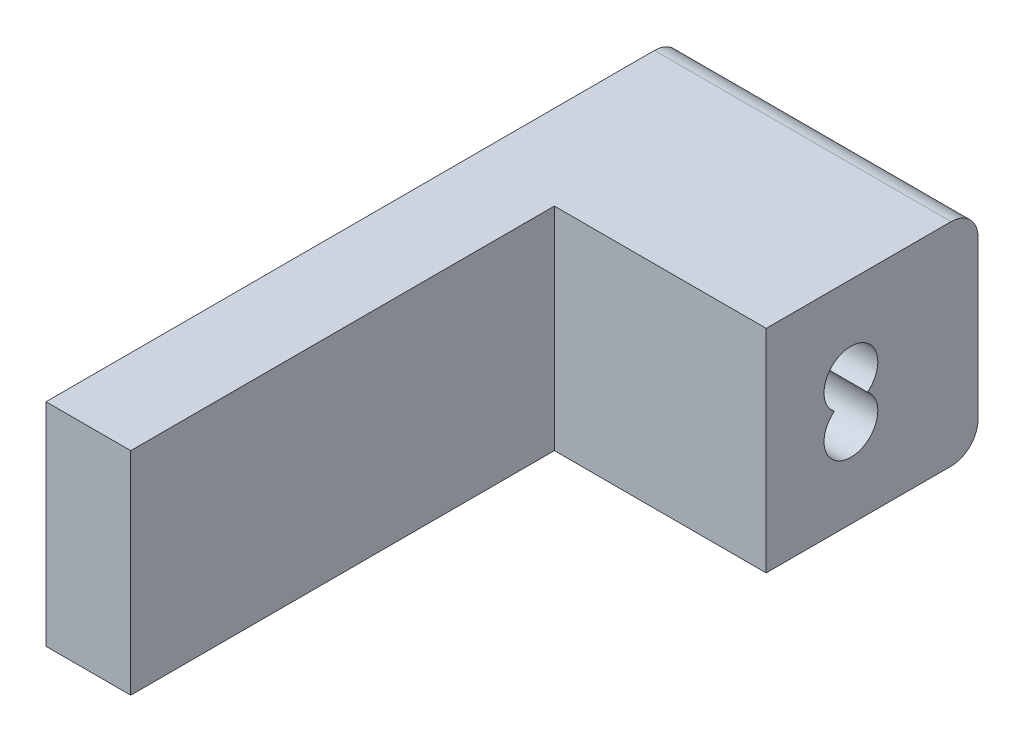
ISO-10303-21;
HEADER;
FILE_DESCRIPTION(('STEP AP214'),'2;1');
FILE_NAME('part.step','',(''),(''),'','','');
FILE_SCHEMA(('AUTOMOTIVE_DESIGN { 1 0 10303 214 1 1 1 1 }'));
ENDSEC;
DATA;
#1=APPLICATION_CONTEXT('core data for automotive mechanical design processes');
#2=APPLICATION_PROTOCOL_DEFINITION('international standard','automotive_design',2000,#1);
#3=PRODUCT_CONTEXT('',#1,'mechanical');
#4=PRODUCT('Part','Part','',(#3));
#5=PRODUCT_RELATED_PRODUCT_CATEGORY('part','',(#4));
#6=PRODUCT_DEFINITION_FORMATION('','',#4);
#7=PRODUCT_DEFINITION_CONTEXT('part definition',#1,'design');
#8=PRODUCT_DEFINITION('design','',#6,#7);
#9=PRODUCT_DEFINITION_SHAPE('','',#8);
#10=(LENGTH_UNIT() NAMED_UNIT(*) SI_UNIT(.MILLI.,.METRE.));
#11=(NAMED_UNIT(*) PLANE_ANGLE_UNIT() SI_UNIT($,.RADIAN.));
#12=(NAMED_UNIT(*) SI_UNIT($,.STERADIAN.) SOLID_ANGLE_UNIT());
#13=UNCERTAINTY_MEASURE_WITH_UNIT(LENGTH_MEASURE(1.E-05),#10,'distance_accuracy_value','');
#14=(GEOMETRIC_REPRESENTATION_CONTEXT(3) GLOBAL_UNCERTAINTY_ASSIGNED_CONTEXT((#13)) GLOBAL_UNIT_ASSIGNED_CONTEXT((#10,
#11,#12)) REPRESENTATION_CONTEXT('',''));
#15=CARTESIAN_POINT('',(0.,0.,0.));
#16=DIRECTION('',(0.,0.,1.));
#17=DIRECTION('',(1.,0.,0.));
#18=AXIS2_PLACEMENT_3D('',#15,#16,#17);
#19=CARTESIAN_POINT('',(-150.,25.,-150.));
#20=DIRECTION('',(0.,0.,-1.));
#21=DIRECTION('',(1.,0.,0.));
#22=AXIS2_PLACEMENT_3D('',#19,#20,#21);
#23=PLANE('',#22);
#24=DIRECTION('',(-1.,0.,0.));
#25=VECTOR('',#24,1.);
#26=CARTESIAN_POINT('',(-150.,0.,-150.));
#27=LINE('',#26,#25);
#28=CARTESIAN_POINT('',(-125.,0.,-150.));
#29=VERTEX_POINT('',#28);
#30=CARTESIAN_POINT('',(-150.,0.,-150.));
#31=VERTEX_POINT('',#30);
#32=EDGE_CURVE('E130',#29,#31,#27,.T.);
#33=ORIENTED_EDGE('',*,*,#32,.F.);
#34=DIRECTION('',(0.,-1.,0.));
#35=VECTOR('',#34,1.);
#36=CARTESIAN_POINT('',(-125.,25.,-150.));
#37=LINE('',#36,#35);
#38=CARTESIAN_POINT('',(-125.,25.,-150.));
#39=VERTEX_POINT('',#38);
#40=EDGE_CURVE('E151',#39,#29,#37,.T.);
#41=ORIENTED_EDGE('',*,*,#40,.F.);
#42=DIRECTION('',(-1.,0.,0.));
#43=VECTOR('',#42,1.);
#44=CARTESIAN_POINT('',(-150.,25.,-150.));
#45=LINE('',#44,#43);
#46=CARTESIAN_POINT('',(-150.,25.,-150.));
#47=VERTEX_POINT('',#46);
#48=EDGE_CURVE('E138',#39,#47,#45,.T.);
#49=ORIENTED_EDGE('',*,*,#48,.T.);
#50=DIRECTION('',(0.,-1.,0.));
#51=VECTOR('',#50,1.);
#52=CARTESIAN_POINT('',(-150.,25.,-150.));
#53=LINE('',#52,#51);
#54=EDGE_CURVE('E174',#47,#31,#53,.T.);
#55=ORIENTED_EDGE('',*,*,#54,.T.);
#56=EDGE_LOOP('',(#33,#41,#49,#55));
#57=FACE_BOUND('',#56,.T.);
#58=ADVANCED_FACE('F32',(#57),#23,.F.);
#59=CARTESIAN_POINT('',(-150.,25.,-100.));
#60=DIRECTION('',(-1.,0.,0.));
#61=DIRECTION('',(0.,0.,-1.));
#62=AXIS2_PLACEMENT_3D('',#59,#60,#61);
#63=PLANE('',#62);
#64=DIRECTION('',(0.,0.,1.));
#65=VECTOR('',#64,1.);
#66=CARTESIAN_POINT('',(-150.,0.,-100.));
#67=LINE('',#66,#65);
#68=CARTESIAN_POINT('',(-150.,0.,-100.));
#69=VERTEX_POINT('',#68);
#70=EDGE_CURVE('E134',#31,#69,#67,.T.);
#71=ORIENTED_EDGE('',*,*,#70,.F.);
#72=ORIENTED_EDGE('',*,*,#54,.F.);
#73=DIRECTION('',(0.,0.,1.));
#74=VECTOR('',#73,1.);
#75=CARTESIAN_POINT('',(-150.,25.,-100.));
#76=LINE('',#75,#74);
#77=CARTESIAN_POINT('',(-150.,25.,-100.));
#78=VERTEX_POINT('',#77);
#79=EDGE_CURVE('E141',#47,#78,#76,.T.);
#80=ORIENTED_EDGE('',*,*,#79,.T.);
#81=DIRECTION('',(0.,-1.,0.));
#82=VECTOR('',#81,1.);
#83=CARTESIAN_POINT('',(-150.,25.,-100.));
#84=LINE('',#83,#82);
#85=EDGE_CURVE('E171',#78,#69,#84,.T.);
#86=ORIENTED_EDGE('',*,*,#85,.T.);
#87=EDGE_LOOP('',(#71,#72,#80,#86));
#88=FACE_BOUND('',#87,.T.);
#89=ADVANCED_FACE('F211',(#88),#63,.F.);
#90=CARTESIAN_POINT('',(-160.,25.,-100.));
#91=DIRECTION('',(0.,0.,-1.));
#92=DIRECTION('',(1.,0.,0.));
#93=AXIS2_PLACEMENT_3D('',#90,#91,#92);
#94=PLANE('',#93);
#95=DIRECTION('',(-1.,0.,0.));
#96=VECTOR('',#95,1.);
#97=CARTESIAN_POINT('',(-160.,0.,-100.));
#98=LINE('',#97,#96);
#99=CARTESIAN_POINT('',(-160.,0.,-100.));
#100=VERTEX_POINT('',#99);
#101=EDGE_CURVE('E155',#69,#100,#98,.T.);
#102=ORIENTED_EDGE('',*,*,#101,.F.);
#103=ORIENTED_EDGE('',*,*,#85,.F.);
#104=DIRECTION('',(-1.,0.,0.));
#105=VECTOR('',#104,1.);
#106=CARTESIAN_POINT('',(-160.,25.,-100.));
#107=LINE('',#106,#105);
#108=CARTESIAN_POINT('',(-160.,25.,-100.));
#109=VERTEX_POINT('',#108);
#110=EDGE_CURVE('E145',#78,#109,#107,.T.);
#111=ORIENTED_EDGE('',*,*,#110,.T.);
#112=DIRECTION('',(0.,-1.,0.));
#113=VECTOR('',#112,1.);
#114=CARTESIAN_POINT('',(-160.,25.,-100.));
#115=LINE('',#114,#113);
#116=EDGE_CURVE('E168',#109,#100,#115,.T.);
#117=ORIENTED_EDGE('',*,*,#116,.T.);
#118=EDGE_LOOP('',(#102,#103,#111,#117));
#119=FACE_BOUND('',#118,.T.);
#120=ADVANCED_FACE('F214',(#119),#94,.F.);
#121=CARTESIAN_POINT('',(-160.,25.,-175.));
#122=DIRECTION('',(1.,0.,0.));
#123=DIRECTION('',(0.,0.,1.));
#124=AXIS2_PLACEMENT_3D('',#121,#122,#123);
#125=PLANE('',#124);
#126=CARTESIAN_POINT('',(-160.,15.,-160.000000000001));
#127=DIRECTION('',(1.,0.,0.));
#128=DIRECTION('',(0.,0.,-1.));
#129=AXIS2_PLACEMENT_3D('',#126,#127,#128);
#130=CIRCLE('',#129,3.175);
#131=CARTESIAN_POINT('',(-160.,12.5,-161.957198252606));
#132=VERTEX_POINT('',#131);
#133=CARTESIAN_POINT('',(-160.,12.5,-158.042801747396));
#134=VERTEX_POINT('',#133);
#135=EDGE_CURVE('E131',#132,#134,#130,.T.);
#136=ORIENTED_EDGE('',*,*,#135,.T.);
#137=CARTESIAN_POINT('',(-160.,10.,-160.000000000001));
#138=DIRECTION('',(1.,0.,0.));
#139=DIRECTION('',(0.,0.,1.));
#140=AXIS2_PLACEMENT_3D('',#137,#138,#139);
#141=CIRCLE('',#140,3.175);
#142=EDGE_CURVE('E115',#134,#132,#141,.T.);
#143=ORIENTED_EDGE('',*,*,#142,.T.);
#144=EDGE_LOOP('',(#136,#143));
#145=FACE_BOUND('',#144,.T.);
#146=DIRECTION('',(0.,-1.,0.));
#147=VECTOR('',#146,1.);
#148=CARTESIAN_POINT('',(-160.,25.,-175.));
#149=LINE('',#148,#147);
#150=CARTESIAN_POINT('',(-160.,21.82,-175.));
#151=VERTEX_POINT('',#150);
#152=CARTESIAN_POINT('',(-160.,3.18,-175.));
#153=VERTEX_POINT('',#152);
#154=EDGE_CURVE('E166',#151,#153,#149,.T.);
#155=ORIENTED_EDGE('',*,*,#154,.T.);
#156=CARTESIAN_POINT('',(-160.,3.18,-171.82));
#157=DIRECTION('',(1.,0.,0.));
#158=DIRECTION('',(0.,0.,-1.));
#159=AXIS2_PLACEMENT_3D('',#156,#157,#158);
#160=CIRCLE('',#159,3.18);
#161=CARTESIAN_POINT('',(-160.,0.,-171.82));
#162=VERTEX_POINT('',#161);
#163=EDGE_CURVE('E40',#153,#162,#160,.F.);
#164=ORIENTED_EDGE('',*,*,#163,.T.);
#165=DIRECTION('',(0.,0.,-1.));
#166=VECTOR('',#165,1.);
#167=CARTESIAN_POINT('',(-160.,0.,-175.));
#168=LINE('',#167,#166);
#169=EDGE_CURVE('E158',#100,#162,#168,.T.);
#170=ORIENTED_EDGE('',*,*,#169,.F.);
#171=ORIENTED_EDGE('',*,*,#116,.F.);
#172=DIRECTION('',(0.,0.,-1.));
#173=VECTOR('',#172,1.);
#174=CARTESIAN_POINT('',(-160.,25.,-175.));
#175=LINE('',#174,#173);
#176=CARTESIAN_POINT('',(-160.,25.,-171.82));
#177=VERTEX_POINT('',#176);
#178=EDGE_CURVE('E148',#109,#177,#175,.T.);
#179=ORIENTED_EDGE('',*,*,#178,.T.);
#180=CARTESIAN_POINT('',(-160.,21.82,-171.82));
#181=DIRECTION('',(1.,0.,0.));
#182=DIRECTION('',(0.,0.,-1.));
#183=AXIS2_PLACEMENT_3D('',#180,#181,#182);
#184=CIRCLE('',#183,3.18);
#185=EDGE_CURVE('E188',#177,#151,#184,.F.);
#186=ORIENTED_EDGE('',*,*,#185,.T.);
#187=EDGE_LOOP('',(#155,#164,#170,#171,#179,#186));
#188=FACE_BOUND('',#187,.T.);
#189=ADVANCED_FACE('F191',(#145,#188),#125,.F.);
#190=CARTESIAN_POINT('',(-125.,25.,-175.));
#191=DIRECTION('',(0.,0.,1.));
#192=DIRECTION('',(-1.,0.,0.));
#193=AXIS2_PLACEMENT_3D('',#190,#191,#192);
#194=PLANE('',#193);
#195=DIRECTION('',(0.,-1.,0.));
#196=VECTOR('',#195,1.);
#197=CARTESIAN_POINT('',(-125.,25.,-175.));
#198=LINE('',#197,#196);
#199=CARTESIAN_POINT('',(-125.,21.82,-175.));
#200=VERTEX_POINT('',#199);
#201=CARTESIAN_POINT('',(-125.,3.18,-175.));
#202=VERTEX_POINT('',#201);
#203=EDGE_CURVE('E164',#200,#202,#198,.T.);
#204=ORIENTED_EDGE('',*,*,#203,.T.);
#205=DIRECTION('',(1.,0.,0.));
#206=VECTOR('',#205,1.);
#207=CARTESIAN_POINT('',(-160.,3.18,-175.));
#208=LINE('',#207,#206);
#209=EDGE_CURVE('E53',#202,#153,#208,.F.);
#210=ORIENTED_EDGE('',*,*,#209,.T.);
#211=ORIENTED_EDGE('',*,*,#154,.F.);
#212=DIRECTION('',(1.,0.,0.));
#213=VECTOR('',#212,1.);
#214=CARTESIAN_POINT('',(-125.,21.82,-175.));
#215=LINE('',#214,#213);
#216=EDGE_CURVE('E184',#151,#200,#215,.T.);
#217=ORIENTED_EDGE('',*,*,#216,.T.);
#218=EDGE_LOOP('',(#204,#210,#211,#217));
#219=FACE_BOUND('',#218,.T.);
#220=ADVANCED_FACE('F200',(#219),#194,.F.);
#221=CARTESIAN_POINT('',(-125.,25.,-150.));
#222=DIRECTION('',(-1.,0.,0.));
#223=DIRECTION('',(0.,0.,-1.));
#224=AXIS2_PLACEMENT_3D('',#221,#222,#223);
#225=PLANE('',#224);
#226=CARTESIAN_POINT('',(-125.,15.,-160.000000000001));
#227=DIRECTION('',(1.,0.,0.));
#228=DIRECTION('',(0.,0.,-1.));
#229=AXIS2_PLACEMENT_3D('',#226,#227,#228);
#230=CIRCLE('',#229,3.175);
#231=CARTESIAN_POINT('',(-125.,12.5,-161.957198252606));
#232=VERTEX_POINT('',#231);
#233=CARTESIAN_POINT('',(-125.,12.5,-158.042801747396));
#234=VERTEX_POINT('',#233);
#235=EDGE_CURVE('E127',#232,#234,#230,.T.);
#236=ORIENTED_EDGE('',*,*,#235,.F.);
#237=CARTESIAN_POINT('',(-125.,10.,-160.000000000001));
#238=DIRECTION('',(1.,0.,0.));
#239=DIRECTION('',(0.,0.,1.));
#240=AXIS2_PLACEMENT_3D('',#237,#238,#239);
#241=CIRCLE('',#240,3.175);
#242=EDGE_CURVE('E112',#234,#232,#241,.T.);
#243=ORIENTED_EDGE('',*,*,#242,.F.);
#244=EDGE_LOOP('',(#236,#243));
#245=FACE_BOUND('',#244,.T.);
#246=DIRECTION('',(0.,0.,1.));
#247=VECTOR('',#246,1.);
#248=CARTESIAN_POINT('',(-125.,0.,-150.));
#249=LINE('',#248,#247);
#250=CARTESIAN_POINT('',(-125.,0.,-171.82));
#251=VERTEX_POINT('',#250);
#252=EDGE_CURVE('E142',#251,#29,#249,.T.);
#253=ORIENTED_EDGE('',*,*,#252,.F.);
#254=CARTESIAN_POINT('',(-125.,3.18,-171.82));
#255=DIRECTION('',(-1.,0.,0.));
#256=DIRECTION('',(0.,0.,1.));
#257=AXIS2_PLACEMENT_3D('',#254,#255,#256);
#258=CIRCLE('',#257,3.18);
#259=EDGE_CURVE('E182',#251,#202,#258,.F.);
#260=ORIENTED_EDGE('',*,*,#259,.T.);
#261=ORIENTED_EDGE('',*,*,#203,.F.);
#262=CARTESIAN_POINT('',(-125.,21.82,-171.82));
#263=DIRECTION('',(-1.,0.,0.));
#264=DIRECTION('',(0.,0.,1.));
#265=AXIS2_PLACEMENT_3D('',#262,#263,#264);
#266=CIRCLE('',#265,3.18);
#267=CARTESIAN_POINT('',(-125.,25.,-171.82));
#268=VERTEX_POINT('',#267);
#269=EDGE_CURVE('E180',#200,#268,#266,.F.);
#270=ORIENTED_EDGE('',*,*,#269,.T.);
#271=DIRECTION('',(0.,0.,1.));
#272=VECTOR('',#271,1.);
#273=CARTESIAN_POINT('',(-125.,25.,-150.));
#274=LINE('',#273,#272);
#275=EDGE_CURVE('E150',#268,#39,#274,.T.);
#276=ORIENTED_EDGE('',*,*,#275,.T.);
#277=ORIENTED_EDGE('',*,*,#40,.T.);
#278=EDGE_LOOP('',(#253,#260,#261,#270,#276,#277));
#279=FACE_BOUND('',#278,.T.);
#280=ADVANCED_FACE('F125',(#245,#279),#225,.F.);
#281=CARTESIAN_POINT('',(0.,25.,0.));
#282=DIRECTION('',(0.,-1.,0.));
#283=DIRECTION('',(0.,0.,-1.));
#284=AXIS2_PLACEMENT_3D('',#281,#282,#283);
#285=PLANE('',#284);
#286=ORIENTED_EDGE('',*,*,#275,.F.);
#287=DIRECTION('',(1.,0.,0.));
#288=VECTOR('',#287,1.);
#289=CARTESIAN_POINT('',(1.36256085779353E-13,25.,-171.82));
#290=LINE('',#289,#288);
#291=EDGE_CURVE('E11',#268,#177,#290,.F.);
#292=ORIENTED_EDGE('',*,*,#291,.T.);
#293=ORIENTED_EDGE('',*,*,#178,.F.);
#294=ORIENTED_EDGE('',*,*,#110,.F.);
#295=ORIENTED_EDGE('',*,*,#79,.F.);
#296=ORIENTED_EDGE('',*,*,#48,.F.);
#297=EDGE_LOOP('',(#286,#292,#293,#294,#295,#296));
#298=FACE_BOUND('',#297,.T.);
#299=ADVANCED_FACE('F205',(#298),#285,.F.);
#300=CARTESIAN_POINT('',(0.,0.,0.));
#301=DIRECTION('',(0.,-1.,0.));
#302=DIRECTION('',(0.,0.,-1.));
#303=AXIS2_PLACEMENT_3D('',#300,#301,#302);
#304=PLANE('',#303);
#305=ORIENTED_EDGE('',*,*,#169,.T.);
#306=DIRECTION('',(1.,0.,0.));
#307=VECTOR('',#306,1.);
#308=CARTESIAN_POINT('',(-125.,0.,-171.82));
#309=LINE('',#308,#307);
#310=EDGE_CURVE('E120',#162,#251,#309,.T.);
#311=ORIENTED_EDGE('',*,*,#310,.T.);
#312=ORIENTED_EDGE('',*,*,#252,.T.);
#313=ORIENTED_EDGE('',*,*,#32,.T.);
#314=ORIENTED_EDGE('',*,*,#70,.T.);
#315=ORIENTED_EDGE('',*,*,#101,.T.);
#316=EDGE_LOOP('',(#305,#311,#312,#313,#314,#315));
#317=FACE_BOUND('',#316,.T.);
#318=ADVANCED_FACE('F196',(#317),#304,.T.);
#319=CARTESIAN_POINT('',(153.980256121069,15.,-160.));
#320=DIRECTION('',(-1.,0.,0.));
#321=DIRECTION('',(0.,0.,-1.));
#322=AXIS2_PLACEMENT_3D('',#319,#320,#321);
#323=CYLINDRICAL_SURFACE('',#322,3.175);
#324=ORIENTED_EDGE('',*,*,#235,.T.);
#325=DIRECTION('',(1.,0.,0.));
#326=VECTOR('',#325,1.);
#327=CARTESIAN_POINT('',(-142.5,12.5,-158.042801747396));
#328=LINE('',#327,#326);
#329=EDGE_CURVE('E109',#234,#134,#328,.F.);
#330=ORIENTED_EDGE('',*,*,#329,.T.);
#331=ORIENTED_EDGE('',*,*,#135,.F.);
#332=DIRECTION('',(1.,0.,0.));
#333=VECTOR('',#332,1.);
#334=CARTESIAN_POINT('',(-142.5,12.5,-161.957198252606));
#335=LINE('',#334,#333);
#336=EDGE_CURVE('E121',#132,#232,#335,.T.);
#337=ORIENTED_EDGE('',*,*,#336,.T.);
#338=EDGE_LOOP('',(#324,#330,#331,#337));
#339=FACE_BOUND('',#338,.T.);
#340=ADVANCED_FACE('F129',(#339),#323,.F.);
#341=CARTESIAN_POINT('',(-160.,10.,-160.000000000001));
#342=DIRECTION('',(1.,0.,0.));
#343=DIRECTION('',(0.,0.,-1.));
#344=AXIS2_PLACEMENT_3D('',#341,#342,#343);
#345=CYLINDRICAL_SURFACE('',#344,3.175);
#346=ORIENTED_EDGE('',*,*,#242,.T.);
#347=ORIENTED_EDGE('',*,*,#336,.F.);
#348=ORIENTED_EDGE('',*,*,#142,.F.);
#349=ORIENTED_EDGE('',*,*,#329,.F.);
#350=EDGE_LOOP('',(#346,#347,#348,#349));
#351=FACE_BOUND('',#350,.T.);
#352=ADVANCED_FACE('F111',(#351),#345,.F.);
#353=CARTESIAN_POINT('',(1.36256085779353E-13,3.18,-171.82));
#354=DIRECTION('',(-1.,0.,0.));
#355=DIRECTION('',(0.,0.,1.));
#356=AXIS2_PLACEMENT_3D('',#353,#354,#355);
#357=CYLINDRICAL_SURFACE('',#356,3.18);
#358=ORIENTED_EDGE('',*,*,#163,.F.);
#359=ORIENTED_EDGE('',*,*,#209,.F.);
#360=ORIENTED_EDGE('',*,*,#259,.F.);
#361=ORIENTED_EDGE('',*,*,#310,.F.);
#362=EDGE_LOOP('',(#358,#359,#360,#361));
#363=FACE_BOUND('',#362,.T.);
#364=ADVANCED_FACE('F198',(#363),#357,.T.);
#365=CARTESIAN_POINT('',(-125.,21.82,-171.82));
#366=DIRECTION('',(1.,0.,0.));
#367=DIRECTION('',(0.,0.,-1.));
#368=AXIS2_PLACEMENT_3D('',#365,#366,#367);
#369=CYLINDRICAL_SURFACE('',#368,3.18);
#370=ORIENTED_EDGE('',*,*,#185,.F.);
#371=ORIENTED_EDGE('',*,*,#291,.F.);
#372=ORIENTED_EDGE('',*,*,#269,.F.);
#373=ORIENTED_EDGE('',*,*,#216,.F.);
#374=EDGE_LOOP('',(#370,#371,#372,#373));
#375=FACE_BOUND('',#374,.T.);
#376=ADVANCED_FACE('F34',(#375),#369,.T.);
#377=CLOSED_SHELL('',(#58,#89,#120,#189,#220,#280,#299,#318,#340,#352,#364,#376));
#378=MANIFOLD_SOLID_BREP('B2',#377);
#379=ADVANCED_BREP_SHAPE_REPRESENTATION('',(#18,#378),#14);
#380=SHAPE_DEFINITION_REPRESENTATION(#9,#379);
ENDSEC;
END-ISO-10303-21;
